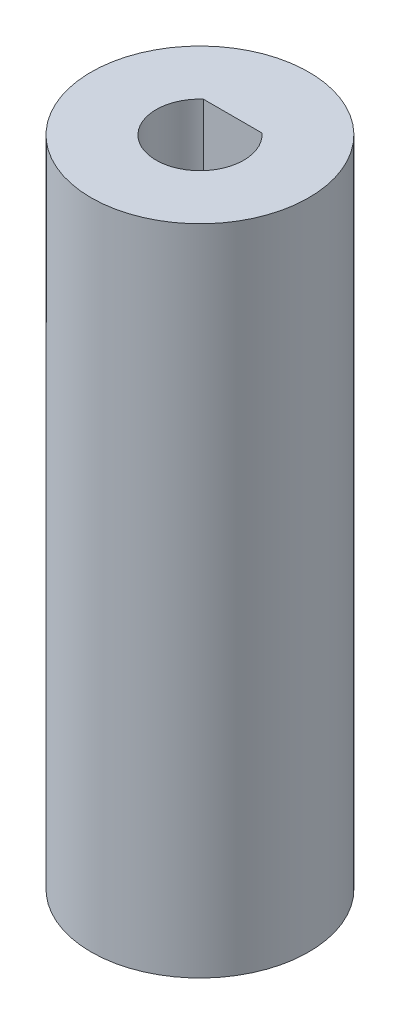
ISO-10303-21;
HEADER;
FILE_DESCRIPTION(('STEP AP214'),'2;1');
FILE_NAME('part.step','',(''),(''),'','','');
FILE_SCHEMA(('AUTOMOTIVE_DESIGN { 1 0 10303 214 1 1 1 1 }'));
ENDSEC;
DATA;
#1=APPLICATION_CONTEXT('core data for automotive mechanical design processes');
#2=APPLICATION_PROTOCOL_DEFINITION('international standard','automotive_design',2000,#1);
#3=PRODUCT_CONTEXT('',#1,'mechanical');
#4=PRODUCT('Part','Part','',(#3));
#5=PRODUCT_RELATED_PRODUCT_CATEGORY('part','',(#4));
#6=PRODUCT_DEFINITION_FORMATION('','',#4);
#7=PRODUCT_DEFINITION_CONTEXT('part definition',#1,'design');
#8=PRODUCT_DEFINITION('design','',#6,#7);
#9=PRODUCT_DEFINITION_SHAPE('','',#8);
#10=(LENGTH_UNIT() NAMED_UNIT(*) SI_UNIT(.MILLI.,.METRE.));
#11=(NAMED_UNIT(*) PLANE_ANGLE_UNIT() SI_UNIT($,.RADIAN.));
#12=(NAMED_UNIT(*) SI_UNIT($,.STERADIAN.) SOLID_ANGLE_UNIT());
#13=UNCERTAINTY_MEASURE_WITH_UNIT(LENGTH_MEASURE(1.E-05),#10,'distance_accuracy_value','');
#14=(GEOMETRIC_REPRESENTATION_CONTEXT(3) GLOBAL_UNCERTAINTY_ASSIGNED_CONTEXT((#13)) GLOBAL_UNIT_ASSIGNED_CONTEXT((#10,
#11,#12)) REPRESENTATION_CONTEXT('',''));
#15=CARTESIAN_POINT('',(0.,0.,0.));
#16=DIRECTION('',(0.,0.,1.));
#17=DIRECTION('',(1.,0.,0.));
#18=AXIS2_PLACEMENT_3D('',#15,#16,#17);
#19=CARTESIAN_POINT('',(0.,-0.001000000000001,-1.5));
#20=DIRECTION('',(0.,0.,-1.));
#21=DIRECTION('',(-1.,0.,0.));
#22=AXIS2_PLACEMENT_3D('',#19,#20,#21);
#23=PLANE('',#22);
#24=DIRECTION('',(0.,1.,0.));
#25=VECTOR('',#24,1.);
#26=CARTESIAN_POINT('',(-1.34544602270028,-0.001000000000001,-1.5));
#27=LINE('',#26,#25);
#28=CARTESIAN_POINT('',(-1.34544602270028,26.1107925990308,-1.5));
#29=VERTEX_POINT('',#28);
#30=CARTESIAN_POINT('',(-1.34544602270028,30.,-1.5));
#31=VERTEX_POINT('',#30);
#32=EDGE_CURVE('E103',#29,#31,#27,.T.);
#33=ORIENTED_EDGE('',*,*,#32,.F.);
#34=CARTESIAN_POINT('',(0.,26.,-1.5));
#35=DIRECTION('',(0.,0.,1.));
#36=DIRECTION('',(1.,0.,0.));
#37=AXIS2_PLACEMENT_3D('',#34,#35,#36);
#38=CIRCLE('',#37,1.35);
#39=CARTESIAN_POINT('',(1.34544602270028,26.1107925990308,-1.5));
#40=VERTEX_POINT('',#39);
#41=EDGE_CURVE('E65',#40,#29,#38,.T.);
#42=ORIENTED_EDGE('',*,*,#41,.F.);
#43=DIRECTION('',(0.,1.,0.));
#44=VECTOR('',#43,1.);
#45=CARTESIAN_POINT('',(1.34544602270028,-0.001000000000001,-1.5));
#46=LINE('',#45,#44);
#47=CARTESIAN_POINT('',(1.34544602270028,30.,-1.5));
#48=VERTEX_POINT('',#47);
#49=EDGE_CURVE('E72',#40,#48,#46,.T.);
#50=ORIENTED_EDGE('',*,*,#49,.T.);
#51=DIRECTION('',(-1.,0.,0.));
#52=VECTOR('',#51,1.);
#53=CARTESIAN_POINT('',(0.,30.,-1.5));
#54=LINE('',#53,#52);
#55=EDGE_CURVE('E113',#48,#31,#54,.T.);
#56=ORIENTED_EDGE('',*,*,#55,.T.);
#57=EDGE_LOOP('',(#33,#42,#50,#56));
#58=FACE_BOUND('',#57,.T.);
#59=ADVANCED_FACE('F45',(#58),#23,.F.);
#60=CARTESIAN_POINT('',(0.,30.,0.));
#61=DIRECTION('',(0.,-1.,0.));
#62=DIRECTION('',(0.,0.,-1.));
#63=AXIS2_PLACEMENT_3D('',#60,#61,#62);
#64=CYLINDRICAL_SURFACE('',#63,5.);
#65=CARTESIAN_POINT('',(1.35,26.,-4.81430161082581));
#66=CARTESIAN_POINT('',(1.34999827950078,25.9256684176017,-4.81430286400938));
#67=CARTESIAN_POINT('',(1.34383999324408,25.8513187790562,-4.81604192347854));
#68=CARTESIAN_POINT('',(1.31941781676321,25.7047692451855,-4.8227888060397));
#69=CARTESIAN_POINT('',(1.30114805173568,25.632570410899,-4.82779821543225));
#70=CARTESIAN_POINT('',(1.25314927799182,25.4924637834497,-4.84047800974609));
#71=CARTESIAN_POINT('',(1.22343665790433,25.4245500143166,-4.84814458746717));
#72=CARTESIAN_POINT('',(1.15344721105168,25.2946599662433,-4.86527000645852));
#73=CARTESIAN_POINT('',(1.11316948823248,25.232684191529,-4.87472899972935));
#74=CARTESIAN_POINT('',(1.02208874781842,25.1148403458518,-4.89464524579835));
#75=CARTESIAN_POINT('',(0.971063477465753,25.0591470669157,-4.90512055052544));
#76=CARTESIAN_POINT('',(0.860413894491481,24.9569954190049,-4.92573346302849));
#77=CARTESIAN_POINT('',(0.800788672518356,24.9105380278621,-4.93587103495316));
#78=CARTESIAN_POINT('',(0.673416712393974,24.8274451812963,-4.95486803596751));
#79=CARTESIAN_POINT('',(0.605552481604264,24.7909839205944,-4.96370368891586));
#80=CARTESIAN_POINT('',(0.46437855120402,24.7300550902043,-4.97889393892369));
#81=CARTESIAN_POINT('',(0.391069796355657,24.7055854452421,-4.98524896524269));
#82=CARTESIAN_POINT('',(0.242912676824636,24.6699013625708,-4.99463427074767));
#83=CARTESIAN_POINT('',(0.168140751148454,24.6583894914759,-4.99773903428181));
#84=CARTESIAN_POINT('',(0.0176667618215605,24.648011509261,-5.00053459517544));
#85=CARTESIAN_POINT('',(-0.0580351401628761,24.6491432304143,-5.00022597775456));
#86=CARTESIAN_POINT('',(-0.206148379370574,24.6638117831331,-4.99628394180781));
#87=CARTESIAN_POINT('',(-0.278594192479776,24.6770271963745,-4.99273667292943));
#88=CARTESIAN_POINT('',(-0.420198991263326,24.7149681858209,-4.98281785237573));
#89=CARTESIAN_POINT('',(-0.489357786932137,24.7396944265179,-4.97644613765307));
#90=CARTESIAN_POINT('',(-0.623240499654218,24.8001987426406,-4.96146740609084));
#91=CARTESIAN_POINT('',(-0.687912484772717,24.8360860726304,-4.9528384320638));
#92=CARTESIAN_POINT('',(-0.810425309530123,24.9178097768257,-4.93427357586106));
#93=CARTESIAN_POINT('',(-0.868264785236267,24.9636481323296,-4.92433743357716));
#94=CARTESIAN_POINT('',(-0.977389368797292,25.0656753252255,-4.90386504526534));
#95=CARTESIAN_POINT('',(-1.02841112317434,25.122144353356,-4.89331975386088));
#96=CARTESIAN_POINT('',(-1.12032576142062,25.24294592412,-4.87309871980198));
#97=CARTESIAN_POINT('',(-1.1612179951747,25.3072789710726,-4.86342303298435));
#98=CARTESIAN_POINT('',(-1.23192009284938,25.4425649148987,-4.84599972159756));
#99=CARTESIAN_POINT('',(-1.26165666507138,25.5135578878372,-4.83826495487075));
#100=CARTESIAN_POINT('',(-1.30868527005396,25.6597968809383,-4.82575813863877));
#101=CARTESIAN_POINT('',(-1.32598047849328,25.7350418104891,-4.82098533313083));
#102=CARTESIAN_POINT('',(-1.34717781706697,25.8851816351962,-4.8151043709583));
#103=CARTESIAN_POINT('',(-1.35147350943604,25.960016809697,-4.81388856463109));
#104=CARTESIAN_POINT('',(-1.34763562440945,26.1093365165396,-4.81496442596018));
#105=CARTESIAN_POINT('',(-1.33950340772833,26.1838210863731,-4.81725570963011));
#106=CARTESIAN_POINT('',(-1.31138786826406,26.3287972298596,-4.82498343546737));
#107=CARTESIAN_POINT('',(-1.29164270190256,26.3993386909724,-4.83035662112419));
#108=CARTESIAN_POINT('',(-1.24113031980026,26.5361081653624,-4.84358057249715));
#109=CARTESIAN_POINT('',(-1.21036163810149,26.6023356035559,-4.8514316677206));
#110=CARTESIAN_POINT('',(-1.13788170244313,26.7302393080934,-4.86894659991648));
#111=CARTESIAN_POINT('',(-1.09594020615588,26.7917799517246,-4.87864718957309));
#112=CARTESIAN_POINT('',(-1.00258944531467,26.9070941762386,-4.89868236920764));
#113=CARTESIAN_POINT('',(-0.951178354566399,26.9608662553926,-4.90901708121814));
#114=CARTESIAN_POINT('',(-0.838524492356514,27.060758953215,-4.92952783928794));
#115=CARTESIAN_POINT('',(-0.77703493187416,27.1066046719186,-4.93969004116468));
#116=CARTESIAN_POINT('',(-0.647005001952152,27.1873243302563,-4.95839615105609));
#117=CARTESIAN_POINT('',(-0.578465008171479,27.2221988540528,-4.96694014522275));
#118=CARTESIAN_POINT('',(-0.43676228131373,27.2796632357677,-4.98139207313006));
#119=CARTESIAN_POINT('',(-0.363639019334074,27.3023452293168,-4.98731971511832));
#120=CARTESIAN_POINT('',(-0.214434383857584,27.3350457431967,-4.99595786012573));
#121=CARTESIAN_POINT('',(-0.138353687739474,27.3450671459321,-4.99866909540747));
#122=CARTESIAN_POINT('',(0.0120407393161386,27.3519776660347,-5.00053340347916));
#123=CARTESIAN_POINT('',(0.0863348691058458,27.3492695524848,-4.99979560961501));
#124=CARTESIAN_POINT('',(0.233369155233992,27.3317357322646,-4.99509255068858));
#125=CARTESIAN_POINT('',(0.306109372442115,27.3169105011412,-4.99112741228625));
#126=CARTESIAN_POINT('',(0.447473611999288,27.2757932893041,-4.98043780457784));
#127=CARTESIAN_POINT('',(0.516123554849357,27.2495848462135,-4.97373345827892));
#128=CARTESIAN_POINT('',(0.648090737166486,27.1865196430989,-4.95826558948695));
#129=CARTESIAN_POINT('',(0.711407212742428,27.1496613610789,-4.94950177270312));
#130=CARTESIAN_POINT('',(0.832777842949852,27.0651741751583,-4.9305536644909));
#131=CARTESIAN_POINT('',(0.890641991965974,27.0172795529719,-4.9203372171104));
#132=CARTESIAN_POINT('',(0.997648040020431,26.9125807414222,-4.8997626173395));
#133=CARTESIAN_POINT('',(1.0467876206876,26.8557741914321,-4.88940442806941));
#134=CARTESIAN_POINT('',(1.13605588581353,26.733312683112,-4.86944773351285));
#135=CARTESIAN_POINT('',(1.17595465922588,26.6674861140215,-4.8598718151815));
#136=CARTESIAN_POINT('',(1.24406289776474,26.5298087671947,-4.84288629985513));
#137=CARTESIAN_POINT('',(1.27227982510695,26.4579618705501,-4.83547532081779));
#138=CARTESIAN_POINT('',(1.3126364599563,26.3220092778315,-4.82466037223708));
#139=CARTESIAN_POINT('',(1.32661438020514,26.2584791283327,-4.82080774036926));
#140=CARTESIAN_POINT('',(1.34529634245416,26.1299704699324,-4.81562796428331));
#141=CARTESIAN_POINT('',(1.35000150432585,26.0649921368869,-4.81430051509939));
#142=CARTESIAN_POINT('',(1.35,26.,-4.81430161082581));
#143=B_SPLINE_CURVE_WITH_KNOTS('',3,(#65,#66,#67,#68,#69,#70,#71,#72,#73,#74,#75,#76,#77,#78,
#79,#80,#81,#82,#83,#84,#85,#86,#87,#88,#89,#90,#91,#92,#93,#94,#95,#96,#97,#98,#99,#100,#101,
#102,#103,#104,#105,#106,#107,#108,#109,#110,#111,#112,#113,#114,#115,#116,#117,#118,#119,#120,
#121,#122,#123,#124,#125,#126,#127,#128,#129,#130,#131,#132,#133,#134,#135,#136,#137,#138,#139,
#140,#141,#142),.UNSPECIFIED.,.T.,.F.,(4,2,2,2,2,2,2,2,2,2,2,2,2,2,2,2,2,2,2,2,2,2,2,2,2,2,2,2,
2,2,2,2,2,2,2,2,2,2,4),(0.,0.222755692343454,0.445619513874617,0.668165326449929,
0.890730019824909,1.11845165869998,1.34619739434281,1.57769059856956,1.8091437263254,
2.03516823266293,2.26115398799988,2.48129819326815,2.70145510849998,2.92383880821411,
3.14626682629691,3.37569041153007,3.60512871741317,3.83604905822632,4.06691043530418,
4.29070879096955,4.51448264501876,4.73381996122181,4.9531864567471,5.17747977382432,
5.4018163908385,5.63282035090824,5.86381200906635,6.09303267142769,6.32220113829111,
6.54416828930887,6.76612672945206,6.98648310707522,7.20687099198436,7.43325409621118,
7.65969726726048,7.89128155572098,8.12271768195438,8.31750860033478,8.51227599236395),.UNSPECIFIED.);
#144=CARTESIAN_POINT('',(1.35,26.,-4.81430161082581));
#145=VERTEX_POINT('',#144);
#146=EDGE_CURVE('E99',#145,#145,#143,.T.);
#147=ORIENTED_EDGE('',*,*,#146,.F.);
#148=EDGE_LOOP('',(#147));
#149=FACE_BOUND('',#148,.T.);
#150=CARTESIAN_POINT('',(0.,30.,0.));
#151=DIRECTION('',(0.,1.,0.));
#152=DIRECTION('',(0.,0.,1.));
#153=AXIS2_PLACEMENT_3D('',#150,#151,#152);
#154=CIRCLE('',#153,5.);
#155=CARTESIAN_POINT('',(0.,30.,5.));
#156=VERTEX_POINT('',#155);
#157=EDGE_CURVE('E11',#156,#156,#154,.T.);
#158=ORIENTED_EDGE('',*,*,#157,.F.);
#159=EDGE_LOOP('',(#158));
#160=FACE_BOUND('',#159,.T.);
#161=CARTESIAN_POINT('',(0.,0.,0.));
#162=DIRECTION('',(0.,1.,0.));
#163=DIRECTION('',(0.,0.,1.));
#164=AXIS2_PLACEMENT_3D('',#161,#162,#163);
#165=CIRCLE('',#164,5.);
#166=CARTESIAN_POINT('',(0.,0.,5.));
#167=VERTEX_POINT('',#166);
#168=EDGE_CURVE('E57',#167,#167,#165,.T.);
#169=ORIENTED_EDGE('',*,*,#168,.T.);
#170=EDGE_LOOP('',(#169));
#171=FACE_BOUND('',#170,.T.);
#172=ADVANCED_FACE('F47',(#149,#160,#171),#64,.T.);
#173=CARTESIAN_POINT('',(0.,30.,0.));
#174=DIRECTION('',(0.,1.,0.));
#175=DIRECTION('',(0.,0.,1.));
#176=AXIS2_PLACEMENT_3D('',#173,#174,#175);
#177=PLANE('',#176);
#178=CARTESIAN_POINT('',(0.,30.,0.));
#179=DIRECTION('',(0.,1.,0.));
#180=DIRECTION('',(0.,0.,1.));
#181=AXIS2_PLACEMENT_3D('',#178,#179,#180);
#182=CIRCLE('',#181,2.015);
#183=EDGE_CURVE('E109',#31,#48,#182,.T.);
#184=ORIENTED_EDGE('',*,*,#183,.F.);
#185=ORIENTED_EDGE('',*,*,#55,.F.);
#186=EDGE_LOOP('',(#184,#185));
#187=FACE_BOUND('',#186,.T.);
#188=ORIENTED_EDGE('',*,*,#157,.T.);
#189=EDGE_LOOP('',(#188));
#190=FACE_BOUND('',#189,.T.);
#191=ADVANCED_FACE('F139',(#187,#190),#177,.T.);
#192=CARTESIAN_POINT('',(0.,0.,0.));
#193=DIRECTION('',(0.,1.,0.));
#194=DIRECTION('',(0.,0.,1.));
#195=AXIS2_PLACEMENT_3D('',#192,#193,#194);
#196=PLANE('',#195);
#197=DIRECTION('',(1.,0.,0.));
#198=VECTOR('',#197,1.);
#199=CARTESIAN_POINT('',(0.,0.,-1.5));
#200=LINE('',#199,#198);
#201=CARTESIAN_POINT('',(-1.34544602270028,0.,-1.5));
#202=VERTEX_POINT('',#201);
#203=CARTESIAN_POINT('',(1.34544602270028,0.,-1.5));
#204=VERTEX_POINT('',#203);
#205=EDGE_CURVE('E128',#202,#204,#200,.T.);
#206=ORIENTED_EDGE('',*,*,#205,.F.);
#207=CARTESIAN_POINT('',(0.,0.,0.));
#208=DIRECTION('',(0.,1.,0.));
#209=DIRECTION('',(0.,0.,1.));
#210=AXIS2_PLACEMENT_3D('',#207,#208,#209);
#211=CIRCLE('',#210,2.015);
#212=EDGE_CURVE('E164',#204,#202,#211,.F.);
#213=ORIENTED_EDGE('',*,*,#212,.F.);
#214=EDGE_LOOP('',(#206,#213));
#215=FACE_BOUND('',#214,.T.);
#216=ORIENTED_EDGE('',*,*,#168,.F.);
#217=EDGE_LOOP('',(#216));
#218=FACE_BOUND('',#217,.T.);
#219=ADVANCED_FACE('F137',(#215,#218),#196,.F.);
#220=CARTESIAN_POINT('',(0.,-0.001000000000001,0.));
#221=DIRECTION('',(0.,1.,0.));
#222=DIRECTION('',(0.,0.,1.));
#223=AXIS2_PLACEMENT_3D('',#220,#221,#222);
#224=CYLINDRICAL_SURFACE('',#223,2.015);
#225=ORIENTED_EDGE('',*,*,#212,.T.);
#226=CARTESIAN_POINT('',(-1.34544602270028,25.8892074009692,-1.5));
#227=VERTEX_POINT('',#226);
#228=EDGE_CURVE('E122',#202,#227,#27,.T.);
#229=ORIENTED_EDGE('',*,*,#228,.T.);
#230=CARTESIAN_POINT('',(-1.34544602270028,25.8892074009692,-1.5));
#231=DIRECTION('',(0.,1.,0.));
#232=VECTOR('',#231,1.);
#233=LINE('',#230,#232);
#234=EDGE_CURVE('E100',#227,#29,#233,.T.);
#235=ORIENTED_EDGE('',*,*,#234,.T.);
#236=ORIENTED_EDGE('',*,*,#32,.T.);
#237=ORIENTED_EDGE('',*,*,#183,.T.);
#238=ORIENTED_EDGE('',*,*,#49,.F.);
#239=CARTESIAN_POINT('',(0.,26.,-1.5));
#240=DIRECTION('',(0.,0.,1.));
#241=DIRECTION('',(0.996626683481689,-0.0820685918746634,0.));
#242=AXIS2_PLACEMENT_3D('',#239,#240,#241);
#243=CIRCLE('',#242,1.35);
#244=CARTESIAN_POINT('',(1.34544602270028,25.8892074009692,-1.5));
#245=VERTEX_POINT('',#244);
#246=EDGE_CURVE('E90',#245,#40,#243,.T.);
#247=ORIENTED_EDGE('',*,*,#246,.F.);
#248=EDGE_CURVE('E112',#204,#245,#46,.T.);
#249=ORIENTED_EDGE('',*,*,#248,.F.);
#250=EDGE_LOOP('',(#225,#229,#235,#236,#237,#238,#247,#249));
#251=FACE_BOUND('',#250,.T.);
#252=ADVANCED_FACE('F107',(#251),#224,.F.);
#253=ORIENTED_EDGE('',*,*,#248,.T.);
#254=EDGE_CURVE('E95',#227,#245,#38,.T.);
#255=ORIENTED_EDGE('',*,*,#254,.F.);
#256=ORIENTED_EDGE('',*,*,#228,.F.);
#257=ORIENTED_EDGE('',*,*,#205,.T.);
#258=EDGE_LOOP('',(#253,#255,#256,#257));
#259=FACE_BOUND('',#258,.T.);
#260=ADVANCED_FACE('F146',(#259),#23,.F.);
#261=CARTESIAN_POINT('',(0.,26.,-5.001));
#262=DIRECTION('',(0.,0.,1.));
#263=DIRECTION('',(1.,0.,0.));
#264=AXIS2_PLACEMENT_3D('',#261,#262,#263);
#265=CYLINDRICAL_SURFACE('',#264,1.35);
#266=ORIENTED_EDGE('',*,*,#41,.T.);
#267=ORIENTED_EDGE('',*,*,#234,.F.);
#268=ORIENTED_EDGE('',*,*,#254,.T.);
#269=ORIENTED_EDGE('',*,*,#246,.T.);
#270=EDGE_LOOP('',(#266,#267,#268,#269));
#271=FACE_BOUND('',#270,.T.);
#272=ORIENTED_EDGE('',*,*,#146,.T.);
#273=EDGE_LOOP('',(#272));
#274=FACE_BOUND('',#273,.T.);
#275=ADVANCED_FACE('F92',(#271,#274),#265,.F.);
#276=CLOSED_SHELL('',(#59,#172,#191,#219,#252,#260,#275));
#277=MANIFOLD_SOLID_BREP('B2',#276);
#278=ADVANCED_BREP_SHAPE_REPRESENTATION('',(#18,#277),#14);
#279=SHAPE_DEFINITION_REPRESENTATION(#9,#278);
ENDSEC;
END-ISO-10303-21;
